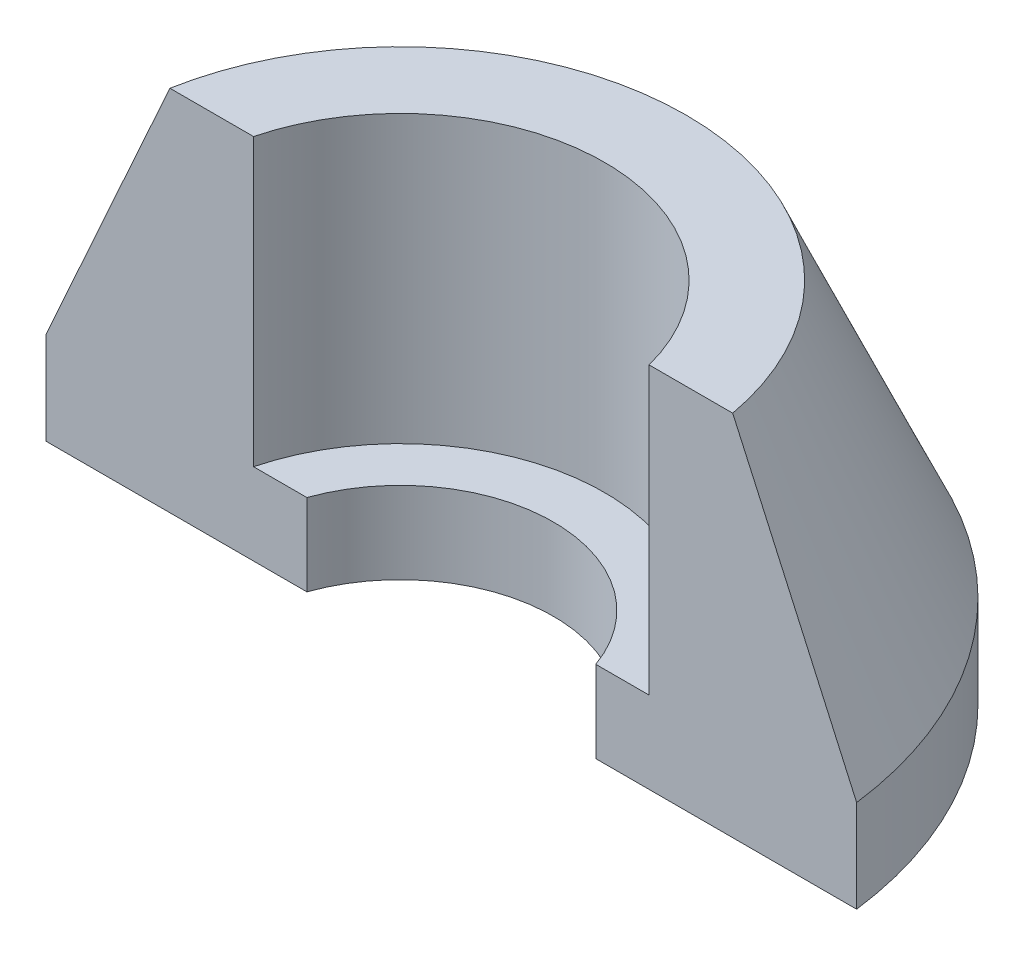
ISO-10303-21;
HEADER;
FILE_DESCRIPTION(('STEP AP214'),'2;1');
FILE_NAME('part.step','',(''),(''),'','','');
FILE_SCHEMA(('AUTOMOTIVE_DESIGN { 1 0 10303 214 1 1 1 1 }'));
ENDSEC;
DATA;
#1=APPLICATION_CONTEXT('core data for automotive mechanical design processes');
#2=APPLICATION_PROTOCOL_DEFINITION('international standard','automotive_design',2000,#1);
#3=PRODUCT_CONTEXT('',#1,'mechanical');
#4=PRODUCT('Part','Part','',(#3));
#5=PRODUCT_RELATED_PRODUCT_CATEGORY('part','',(#4));
#6=PRODUCT_DEFINITION_FORMATION('','',#4);
#7=PRODUCT_DEFINITION_CONTEXT('part definition',#1,'design');
#8=PRODUCT_DEFINITION('design','',#6,#7);
#9=PRODUCT_DEFINITION_SHAPE('','',#8);
#10=(LENGTH_UNIT() NAMED_UNIT(*) SI_UNIT(.MILLI.,.METRE.));
#11=(NAMED_UNIT(*) PLANE_ANGLE_UNIT() SI_UNIT($,.RADIAN.));
#12=(NAMED_UNIT(*) SI_UNIT($,.STERADIAN.) SOLID_ANGLE_UNIT());
#13=UNCERTAINTY_MEASURE_WITH_UNIT(LENGTH_MEASURE(1.E-05),#10,'distance_accuracy_value','');
#14=(GEOMETRIC_REPRESENTATION_CONTEXT(3) GLOBAL_UNCERTAINTY_ASSIGNED_CONTEXT((#13)) GLOBAL_UNIT_ASSIGNED_CONTEXT((#10,
#11,#12)) REPRESENTATION_CONTEXT('',''));
#15=CARTESIAN_POINT('',(0.,0.,0.));
#16=DIRECTION('',(0.,0.,1.));
#17=DIRECTION('',(1.,0.,0.));
#18=AXIS2_PLACEMENT_3D('',#15,#16,#17);
#19=CARTESIAN_POINT('',(0.,0.8,0.));
#20=DIRECTION('',(0.,1.,0.));
#21=DIRECTION('',(0.,0.,1.));
#22=AXIS2_PLACEMENT_3D('',#19,#20,#21);
#23=PLANE('',#22);
#24=DIRECTION('',(1.,0.,0.));
#25=VECTOR('',#24,1.);
#26=CARTESIAN_POINT('',(0.,0.8,-0.5));
#27=LINE('',#26,#25);
#28=CARTESIAN_POINT('',(-1.93649167310371,0.8,-0.5));
#29=VERTEX_POINT('',#28);
#30=CARTESIAN_POINT('',(-1.41421356237309,0.8,-0.5));
#31=VERTEX_POINT('',#30);
#32=EDGE_CURVE('E89',#29,#31,#27,.T.);
#33=ORIENTED_EDGE('',*,*,#32,.T.);
#34=CARTESIAN_POINT('',(0.,0.8,0.));
#35=DIRECTION('',(0.,1.,0.));
#36=DIRECTION('',(0.,0.,1.));
#37=AXIS2_PLACEMENT_3D('',#34,#35,#36);
#38=CIRCLE('',#37,1.5);
#39=CARTESIAN_POINT('',(1.41421356237309,0.8,-0.5));
#40=VERTEX_POINT('',#39);
#41=EDGE_CURVE('E22',#31,#40,#38,.F.);
#42=ORIENTED_EDGE('',*,*,#41,.T.);
#43=DIRECTION('',(1.,0.,0.));
#44=VECTOR('',#43,1.);
#45=CARTESIAN_POINT('',(0.,0.8,-0.5));
#46=LINE('',#45,#44);
#47=CARTESIAN_POINT('',(1.93649167310371,0.8,-0.5));
#48=VERTEX_POINT('',#47);
#49=EDGE_CURVE('E78',#40,#48,#46,.T.);
#50=ORIENTED_EDGE('',*,*,#49,.T.);
#51=CARTESIAN_POINT('',(0.,0.8,0.));
#52=DIRECTION('',(0.,1.,0.));
#53=DIRECTION('',(0.,0.,1.));
#54=AXIS2_PLACEMENT_3D('',#51,#52,#53);
#55=CIRCLE('',#54,2.);
#56=EDGE_CURVE('E93',#48,#29,#55,.T.);
#57=ORIENTED_EDGE('',*,*,#56,.T.);
#58=EDGE_LOOP('',(#33,#42,#50,#57));
#59=FACE_BOUND('',#58,.T.);
#60=ADVANCED_FACE('F17',(#59),#23,.T.);
#61=CARTESIAN_POINT('',(0.,0.,0.));
#62=DIRECTION('',(0.,1.,0.));
#63=DIRECTION('',(0.,0.,1.));
#64=AXIS2_PLACEMENT_3D('',#61,#62,#63);
#65=CYLINDRICAL_SURFACE('',#64,1.5);
#66=DIRECTION('',(0.,1.,0.));
#67=VECTOR('',#66,1.);
#68=CARTESIAN_POINT('',(-1.41421356237309,0.,-0.5));
#69=LINE('',#68,#67);
#70=CARTESIAN_POINT('',(-1.41421356237309,0.,-0.5));
#71=VERTEX_POINT('',#70);
#72=EDGE_CURVE('E74',#71,#31,#69,.T.);
#73=ORIENTED_EDGE('',*,*,#72,.F.);
#74=CARTESIAN_POINT('',(0.,0.,0.));
#75=DIRECTION('',(0.,1.,0.));
#76=DIRECTION('',(0.,0.,1.));
#77=AXIS2_PLACEMENT_3D('',#74,#75,#76);
#78=CIRCLE('',#77,1.5);
#79=CARTESIAN_POINT('',(1.41421356237309,0.,-0.5));
#80=VERTEX_POINT('',#79);
#81=EDGE_CURVE('E96',#71,#80,#78,.F.);
#82=ORIENTED_EDGE('',*,*,#81,.T.);
#83=DIRECTION('',(0.,1.,0.));
#84=VECTOR('',#83,1.);
#85=CARTESIAN_POINT('',(1.41421356237309,0.,-0.5));
#86=LINE('',#85,#84);
#87=EDGE_CURVE('E82',#40,#80,#86,.F.);
#88=ORIENTED_EDGE('',*,*,#87,.F.);
#89=ORIENTED_EDGE('',*,*,#41,.F.);
#90=EDGE_LOOP('',(#73,#82,#88,#89));
#91=FACE_BOUND('',#90,.T.);
#92=ADVANCED_FACE('F94',(#91),#65,.F.);
#93=CARTESIAN_POINT('',(0.,0.8,0.));
#94=DIRECTION('',(0.,1.,0.));
#95=DIRECTION('',(0.,0.,1.));
#96=AXIS2_PLACEMENT_3D('',#93,#94,#95);
#97=CYLINDRICAL_SURFACE('',#96,2.);
#98=DIRECTION('',(0.,1.,0.));
#99=VECTOR('',#98,1.);
#100=CARTESIAN_POINT('',(-1.93649167310371,12.8,-0.5));
#101=LINE('',#100,#99);
#102=CARTESIAN_POINT('',(-1.93649167310371,3.6,-0.5));
#103=VERTEX_POINT('',#102);
#104=EDGE_CURVE('E102',#103,#29,#101,.F.);
#105=ORIENTED_EDGE('',*,*,#104,.T.);
#106=ORIENTED_EDGE('',*,*,#56,.F.);
#107=DIRECTION('',(0.,1.,0.));
#108=VECTOR('',#107,1.);
#109=CARTESIAN_POINT('',(1.93649167310371,12.8,-0.5));
#110=LINE('',#109,#108);
#111=CARTESIAN_POINT('',(1.93649167310371,3.6,-0.5));
#112=VERTEX_POINT('',#111);
#113=EDGE_CURVE('E85',#48,#112,#110,.T.);
#114=ORIENTED_EDGE('',*,*,#113,.T.);
#115=CARTESIAN_POINT('',(0.,3.6,0.));
#116=DIRECTION('',(0.,1.,0.));
#117=DIRECTION('',(0.,0.,1.));
#118=AXIS2_PLACEMENT_3D('',#115,#116,#117);
#119=CIRCLE('',#118,2.);
#120=EDGE_CURVE('E141',#103,#112,#119,.F.);
#121=ORIENTED_EDGE('',*,*,#120,.F.);
#122=EDGE_LOOP('',(#105,#106,#114,#121));
#123=FACE_BOUND('',#122,.T.);
#124=ADVANCED_FACE('F149',(#123),#97,.F.);
#125=CARTESIAN_POINT('',(0.,0.,0.));
#126=DIRECTION('',(0.,1.,0.));
#127=DIRECTION('',(0.,0.,1.));
#128=AXIS2_PLACEMENT_3D('',#125,#126,#127);
#129=PLANE('',#128);
#130=DIRECTION('',(-1.,0.,0.));
#131=VECTOR('',#130,1.);
#132=CARTESIAN_POINT('',(-5.,0.,-0.5));
#133=LINE('',#132,#131);
#134=CARTESIAN_POINT('',(3.96862696659689,0.,-0.5));
#135=VERTEX_POINT('',#134);
#136=EDGE_CURVE('E135',#135,#80,#133,.T.);
#137=ORIENTED_EDGE('',*,*,#136,.T.);
#138=ORIENTED_EDGE('',*,*,#81,.F.);
#139=DIRECTION('',(-1.,0.,0.));
#140=VECTOR('',#139,1.);
#141=CARTESIAN_POINT('',(-5.,0.,-0.5));
#142=LINE('',#141,#140);
#143=CARTESIAN_POINT('',(-3.96862696659689,0.,-0.5));
#144=VERTEX_POINT('',#143);
#145=EDGE_CURVE('E145',#71,#144,#142,.T.);
#146=ORIENTED_EDGE('',*,*,#145,.T.);
#147=CARTESIAN_POINT('',(0.,0.,0.));
#148=DIRECTION('',(0.,-1.,0.));
#149=DIRECTION('',(0.,0.,-1.));
#150=AXIS2_PLACEMENT_3D('',#147,#148,#149);
#151=CIRCLE('',#150,4.);
#152=EDGE_CURVE('E128',#135,#144,#151,.F.);
#153=ORIENTED_EDGE('',*,*,#152,.F.);
#154=EDGE_LOOP('',(#137,#138,#146,#153));
#155=FACE_BOUND('',#154,.T.);
#156=ADVANCED_FACE('F165',(#155),#129,.F.);
#157=CARTESIAN_POINT('',(-5.,12.8,-0.5));
#158=DIRECTION('',(0.,0.,-1.));
#159=DIRECTION('',(-1.,0.,0.));
#160=AXIS2_PLACEMENT_3D('',#157,#158,#159);
#161=PLANE('',#160);
#162=ORIENTED_EDGE('',*,*,#104,.F.);
#163=DIRECTION('',(1.,0.,0.));
#164=VECTOR('',#163,1.);
#165=CARTESIAN_POINT('',(0.,3.6,-0.5));
#166=LINE('',#165,#164);
#167=CARTESIAN_POINT('',(-2.75499546277713,3.60000000001551,-0.5));
#168=VERTEX_POINT('',#167);
#169=EDGE_CURVE('E144',#168,#103,#166,.T.);
#170=ORIENTED_EDGE('',*,*,#169,.F.);
#171=CARTESIAN_POINT('',(-3.96862696660706,0.904755871282054,-0.5));
#172=CARTESIAN_POINT('',(-3.86777690874112,1.12948819902186,-0.5));
#173=CARTESIAN_POINT('',(-3.76687983708057,1.35419944712912,-0.5));
#174=CARTESIAN_POINT('',(-3.56495813598147,1.80356446658173,-0.5));
#175=CARTESIAN_POINT('',(-3.46393350661616,2.02821823796,-0.5));
#176=CARTESIAN_POINT('',(-3.26172301621225,2.47745330670802,-0.5));
#177=CARTESIAN_POINT('',(-3.16053715512895,2.70203460405767,-0.5));
#178=CARTESIAN_POINT('',(-2.95794570590456,3.15109821597823,-0.5));
#179=CARTESIAN_POINT('',(-2.856540117636,3.37558053049162,-0.5));
#180=CARTESIAN_POINT('',(-2.75499546277929,3.60000000001072,-0.5));
#181=B_SPLINE_CURVE_WITH_KNOTS('',3,(#171,#172,#173,#174,#175,#176,#177,#178,#179,#180),
.UNSPECIFIED.,.F.,.F.,(4,2,2,2,4),(0.,0.738971044708505,1.47794166531897,2.2169124907788,
2.95588374505188),.UNSPECIFIED.);
#182=CARTESIAN_POINT('',(-3.96862696660197,0.904755871271937,-0.5));
#183=VERTEX_POINT('',#182);
#184=EDGE_CURVE('E133',#183,#168,#181,.T.);
#185=ORIENTED_EDGE('',*,*,#184,.F.);
#186=DIRECTION('',(0.,-1.,0.));
#187=VECTOR('',#186,1.);
#188=CARTESIAN_POINT('',(-3.96862696659689,3.6,-0.499999999999999));
#189=LINE('',#188,#187);
#190=EDGE_CURVE('E130',#144,#183,#189,.F.);
#191=ORIENTED_EDGE('',*,*,#190,.F.);
#192=ORIENTED_EDGE('',*,*,#145,.F.);
#193=ORIENTED_EDGE('',*,*,#72,.T.);
#194=ORIENTED_EDGE('',*,*,#32,.F.);
#195=EDGE_LOOP('',(#162,#170,#185,#191,#192,#193,#194));
#196=FACE_BOUND('',#195,.T.);
#197=ADVANCED_FACE('F163',(#196),#161,.F.);
#198=CARTESIAN_POINT('',(0.,3.6,0.));
#199=DIRECTION('',(0.,1.,0.));
#200=DIRECTION('',(0.,0.,1.));
#201=AXIS2_PLACEMENT_3D('',#198,#199,#200);
#202=PLANE('',#201);
#203=ORIENTED_EDGE('',*,*,#169,.T.);
#204=ORIENTED_EDGE('',*,*,#120,.T.);
#205=DIRECTION('',(-1.,0.,0.));
#206=VECTOR('',#205,1.);
#207=CARTESIAN_POINT('',(-5.,3.6,-0.5));
#208=LINE('',#207,#206);
#209=CARTESIAN_POINT('',(2.75499546277713,3.60000000001551,-0.5));
#210=VERTEX_POINT('',#209);
#211=EDGE_CURVE('E154',#112,#210,#208,.F.);
#212=ORIENTED_EDGE('',*,*,#211,.T.);
#213=CARTESIAN_POINT('',(0.,3.60000000003102,0.));
#214=DIRECTION('',(0.,-1.,0.));
#215=DIRECTION('',(1.,0.,0.));
#216=AXIS2_PLACEMENT_3D('',#213,#214,#215);
#217=CIRCLE('',#216,2.79999999997926);
#218=EDGE_CURVE('E111',#168,#210,#217,.T.);
#219=ORIENTED_EDGE('',*,*,#218,.F.);
#220=EDGE_LOOP('',(#203,#204,#212,#219));
#221=FACE_BOUND('',#220,.T.);
#222=ADVANCED_FACE('F117',(#221),#202,.T.);
#223=CARTESIAN_POINT('',(-5.,12.8,-0.5));
#224=DIRECTION('',(0.,0.,-1.));
#225=DIRECTION('',(-1.,0.,0.));
#226=AXIS2_PLACEMENT_3D('',#223,#224,#225);
#227=PLANE('',#226);
#228=DIRECTION('',(0.,-1.,0.));
#229=VECTOR('',#228,1.);
#230=CARTESIAN_POINT('',(3.96862696659689,3.6,-0.499999999999999));
#231=LINE('',#230,#229);
#232=CARTESIAN_POINT('',(3.96862696660651,0.904755871283268,-0.5));
#233=VERTEX_POINT('',#232);
#234=EDGE_CURVE('E37',#233,#135,#231,.T.);
#235=ORIENTED_EDGE('',*,*,#234,.F.);
#236=CARTESIAN_POINT('',(2.75499546277929,3.60000000001072,-0.5));
#237=CARTESIAN_POINT('',(2.856540117636,3.37558053049162,-0.5));
#238=CARTESIAN_POINT('',(2.95794570590456,3.15109821597823,-0.5));
#239=CARTESIAN_POINT('',(3.16053715512895,2.70203460405767,-0.5));
#240=CARTESIAN_POINT('',(3.26172301621225,2.47745330670802,-0.5));
#241=CARTESIAN_POINT('',(3.46393350661616,2.02821823796,-0.5));
#242=CARTESIAN_POINT('',(3.56495813598147,1.80356446658173,-0.5));
#243=CARTESIAN_POINT('',(3.76687983708057,1.35419944712912,-0.5));
#244=CARTESIAN_POINT('',(3.86777690874112,1.12948819902187,-0.5));
#245=CARTESIAN_POINT('',(3.96862696660706,0.904755871282054,-0.5));
#246=B_SPLINE_CURVE_WITH_KNOTS('',3,(#236,#237,#238,#239,#240,#241,#242,#243,#244,#245),
.UNSPECIFIED.,.F.,.F.,(4,2,2,2,4),(0.,0.738971254273071,1.47794207973291,2.21691270034337,
2.95588374505188),.UNSPECIFIED.);
#247=EDGE_CURVE('E28',#210,#233,#246,.T.);
#248=ORIENTED_EDGE('',*,*,#247,.F.);
#249=ORIENTED_EDGE('',*,*,#211,.F.);
#250=ORIENTED_EDGE('',*,*,#113,.F.);
#251=ORIENTED_EDGE('',*,*,#49,.F.);
#252=ORIENTED_EDGE('',*,*,#87,.T.);
#253=ORIENTED_EDGE('',*,*,#136,.F.);
#254=EDGE_LOOP('',(#235,#248,#249,#250,#251,#252,#253));
#255=FACE_BOUND('',#254,.T.);
#256=ADVANCED_FACE('F80',(#255),#227,.F.);
#257=CARTESIAN_POINT('',(0.,3.6,0.));
#258=DIRECTION('',(0.,-1.,0.));
#259=DIRECTION('',(0.,0.,-1.));
#260=AXIS2_PLACEMENT_3D('',#257,#258,#259);
#261=CYLINDRICAL_SURFACE('',#260,4.);
#262=ORIENTED_EDGE('',*,*,#152,.T.);
#263=ORIENTED_EDGE('',*,*,#190,.T.);
#264=CARTESIAN_POINT('',(0.,0.90475587126182,0.));
#265=DIRECTION('',(0.,-1.,0.));
#266=DIRECTION('',(0.,0.,1.));
#267=AXIS2_PLACEMENT_3D('',#264,#265,#266);
#268=CIRCLE('',#267,4.0000000000191);
#269=EDGE_CURVE('E11',#233,#183,#268,.F.);
#270=ORIENTED_EDGE('',*,*,#269,.F.);
#271=ORIENTED_EDGE('',*,*,#234,.T.);
#272=EDGE_LOOP('',(#262,#263,#270,#271));
#273=FACE_BOUND('',#272,.T.);
#274=ADVANCED_FACE('F116',(#273),#261,.T.);
#275=CARTESIAN_POINT('',(0.,0.90475587126182,0.));
#276=DIRECTION('',(0.,-1.,0.));
#277=DIRECTION('',(1.,0.,0.));
#278=AXIS2_PLACEMENT_3D('',#275,#276,#277);
#279=CONICAL_SURFACE('',#278,4.0000000000191,0.418879020479374);
#280=ORIENTED_EDGE('',*,*,#269,.T.);
#281=ORIENTED_EDGE('',*,*,#184,.T.);
#282=ORIENTED_EDGE('',*,*,#218,.T.);
#283=ORIENTED_EDGE('',*,*,#247,.T.);
#284=EDGE_LOOP('',(#280,#281,#282,#283));
#285=FACE_BOUND('',#284,.T.);
#286=ADVANCED_FACE('F19',(#285),#279,.T.);
#287=CLOSED_SHELL('',(#60,#92,#124,#156,#197,#222,#256,#274,#286));
#288=MANIFOLD_SOLID_BREP('B1',#287);
#289=ADVANCED_BREP_SHAPE_REPRESENTATION('',(#18,#288),#14);
#290=SHAPE_DEFINITION_REPRESENTATION(#9,#289);
ENDSEC;
END-ISO-10303-21;
